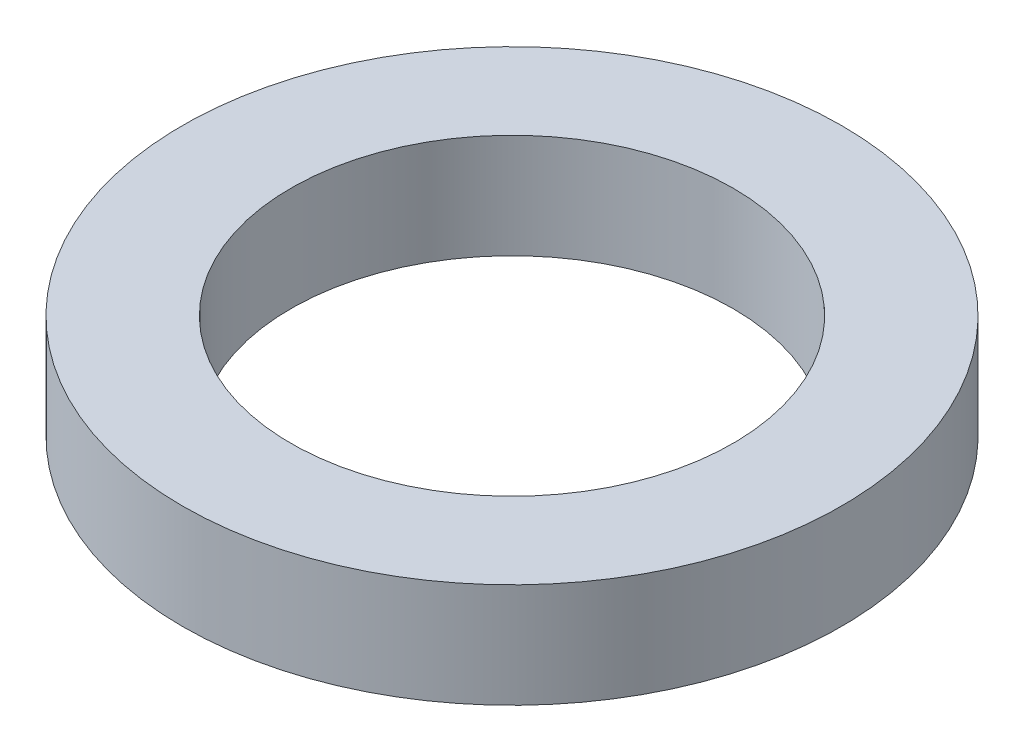
ISO-10303-21;
HEADER;
FILE_DESCRIPTION(('STEP AP214'),'2;1');
FILE_NAME('part.step','',(''),(''),'','','');
FILE_SCHEMA(('AUTOMOTIVE_DESIGN { 1 0 10303 214 1 1 1 1 }'));
ENDSEC;
DATA;
#1=APPLICATION_CONTEXT('core data for automotive mechanical design processes');
#2=APPLICATION_PROTOCOL_DEFINITION('international standard','automotive_design',2000,#1);
#3=PRODUCT_CONTEXT('',#1,'mechanical');
#4=PRODUCT('Part','Part','',(#3));
#5=PRODUCT_RELATED_PRODUCT_CATEGORY('part','',(#4));
#6=PRODUCT_DEFINITION_FORMATION('','',#4);
#7=PRODUCT_DEFINITION_CONTEXT('part definition',#1,'design');
#8=PRODUCT_DEFINITION('design','',#6,#7);
#9=PRODUCT_DEFINITION_SHAPE('','',#8);
#10=(LENGTH_UNIT() NAMED_UNIT(*) SI_UNIT(.MILLI.,.METRE.));
#11=(NAMED_UNIT(*) PLANE_ANGLE_UNIT() SI_UNIT($,.RADIAN.));
#12=(NAMED_UNIT(*) SI_UNIT($,.STERADIAN.) SOLID_ANGLE_UNIT());
#13=UNCERTAINTY_MEASURE_WITH_UNIT(LENGTH_MEASURE(1.E-05),#10,'distance_accuracy_value','');
#14=(GEOMETRIC_REPRESENTATION_CONTEXT(3) GLOBAL_UNCERTAINTY_ASSIGNED_CONTEXT((#13)) GLOBAL_UNIT_ASSIGNED_CONTEXT((#10,
#11,#12)) REPRESENTATION_CONTEXT('',''));
#15=CARTESIAN_POINT('',(0.,0.,0.));
#16=DIRECTION('',(0.,0.,1.));
#17=DIRECTION('',(1.,0.,0.));
#18=AXIS2_PLACEMENT_3D('',#15,#16,#17);
#19=CARTESIAN_POINT('',(0.,0.95,0.));
#20=DIRECTION('',(0.,1.,0.));
#21=DIRECTION('',(0.,0.,1.));
#22=AXIS2_PLACEMENT_3D('',#19,#20,#21);
#23=PLANE('',#22);
#24=CARTESIAN_POINT('',(0.,0.95,0.));
#25=DIRECTION('',(0.,1.,0.));
#26=DIRECTION('',(0.,0.,1.));
#27=AXIS2_PLACEMENT_3D('',#24,#25,#26);
#28=CIRCLE('',#27,6.);
#29=CARTESIAN_POINT('',(0.,0.95,-6.));
#30=VERTEX_POINT('',#29);
#31=EDGE_CURVE('E10',#30,#30,#28,.T.);
#32=ORIENTED_EDGE('',*,*,#31,.T.);
#33=EDGE_LOOP('',(#32));
#34=FACE_BOUND('',#33,.T.);
#35=CARTESIAN_POINT('',(0.,0.95,0.));
#36=DIRECTION('',(0.,1.,0.));
#37=DIRECTION('',(0.,0.,1.));
#38=AXIS2_PLACEMENT_3D('',#35,#36,#37);
#39=CIRCLE('',#38,4.025);
#40=CARTESIAN_POINT('',(0.,0.95,-4.025));
#41=VERTEX_POINT('',#40);
#42=EDGE_CURVE('E41',#41,#41,#39,.T.);
#43=ORIENTED_EDGE('',*,*,#42,.F.);
#44=EDGE_LOOP('',(#43));
#45=FACE_BOUND('',#44,.T.);
#46=ADVANCED_FACE('F30',(#34,#45),#23,.T.);
#47=CARTESIAN_POINT('',(0.,-0.95,0.));
#48=DIRECTION('',(0.,1.,0.));
#49=DIRECTION('',(0.,0.,1.));
#50=AXIS2_PLACEMENT_3D('',#47,#48,#49);
#51=PLANE('',#50);
#52=CARTESIAN_POINT('',(0.,-0.95,0.));
#53=DIRECTION('',(0.,1.,0.));
#54=DIRECTION('',(0.,0.,1.));
#55=AXIS2_PLACEMENT_3D('',#52,#53,#54);
#56=CIRCLE('',#55,6.);
#57=CARTESIAN_POINT('',(0.,-0.95,-6.));
#58=VERTEX_POINT('',#57);
#59=EDGE_CURVE('E34',#58,#58,#56,.T.);
#60=ORIENTED_EDGE('',*,*,#59,.F.);
#61=EDGE_LOOP('',(#60));
#62=FACE_BOUND('',#61,.T.);
#63=CARTESIAN_POINT('',(0.,-0.95,0.));
#64=DIRECTION('',(0.,1.,0.));
#65=DIRECTION('',(0.,0.,1.));
#66=AXIS2_PLACEMENT_3D('',#63,#64,#65);
#67=CIRCLE('',#66,4.025);
#68=CARTESIAN_POINT('',(0.,-0.95,-4.025));
#69=VERTEX_POINT('',#68);
#70=EDGE_CURVE('E43',#69,#69,#67,.T.);
#71=ORIENTED_EDGE('',*,*,#70,.T.);
#72=EDGE_LOOP('',(#71));
#73=FACE_BOUND('',#72,.T.);
#74=ADVANCED_FACE('F53',(#62,#73),#51,.F.);
#75=CARTESIAN_POINT('',(0.,0.95,0.));
#76=DIRECTION('',(0.,-1.,0.));
#77=DIRECTION('',(0.,0.,-1.));
#78=AXIS2_PLACEMENT_3D('',#75,#76,#77);
#79=CYLINDRICAL_SURFACE('',#78,6.);
#80=CARTESIAN_POINT('',(0.,0.95,-6.));
#81=CARTESIAN_POINT('',(0.,0.930208333333333,-6.));
#82=CARTESIAN_POINT('',(0.,0.910416666666667,-6.));
#83=CARTESIAN_POINT('',(0.,0.870833333333333,-6.));
#84=CARTESIAN_POINT('',(0.,0.851041666666667,-6.));
#85=CARTESIAN_POINT('',(0.,0.811458333333333,-6.));
#86=CARTESIAN_POINT('',(0.,0.791666666666667,-6.));
#87=CARTESIAN_POINT('',(0.,0.752083333333333,-6.));
#88=CARTESIAN_POINT('',(0.,0.732291666666667,-6.));
#89=CARTESIAN_POINT('',(0.,0.692708333333333,-6.));
#90=CARTESIAN_POINT('',(0.,0.672916666666667,-6.));
#91=CARTESIAN_POINT('',(0.,0.633333333333333,-6.));
#92=CARTESIAN_POINT('',(0.,0.613541666666667,-6.));
#93=CARTESIAN_POINT('',(0.,0.573958333333333,-6.));
#94=CARTESIAN_POINT('',(0.,0.554166666666667,-6.));
#95=CARTESIAN_POINT('',(0.,0.514583333333333,-6.));
#96=CARTESIAN_POINT('',(0.,0.494791666666667,-6.));
#97=CARTESIAN_POINT('',(0.,0.455208333333333,-6.));
#98=CARTESIAN_POINT('',(0.,0.435416666666667,-6.));
#99=CARTESIAN_POINT('',(0.,0.395833333333333,-6.));
#100=CARTESIAN_POINT('',(0.,0.376041666666667,-6.));
#101=CARTESIAN_POINT('',(0.,0.336458333333333,-6.));
#102=CARTESIAN_POINT('',(0.,0.316666666666667,-6.));
#103=CARTESIAN_POINT('',(0.,0.277083333333333,-6.));
#104=CARTESIAN_POINT('',(0.,0.257291666666667,-6.));
#105=CARTESIAN_POINT('',(0.,0.217708333333333,-6.));
#106=CARTESIAN_POINT('',(0.,0.197916666666667,-6.));
#107=CARTESIAN_POINT('',(0.,0.158333333333333,-6.));
#108=CARTESIAN_POINT('',(0.,0.138541666666667,-6.));
#109=CARTESIAN_POINT('',(0.,0.0989583333333332,-6.));
#110=CARTESIAN_POINT('',(0.,0.0791666666666666,-6.));
#111=CARTESIAN_POINT('',(0.,0.0395833333333332,-6.));
#112=CARTESIAN_POINT('',(0.,0.0197916666666665,-6.));
#113=CARTESIAN_POINT('',(0.,-0.0197916666666667,-6.));
#114=CARTESIAN_POINT('',(0.,-0.0395833333333333,-6.));
#115=CARTESIAN_POINT('',(0.,-0.0791666666666665,-6.));
#116=CARTESIAN_POINT('',(0.,-0.0989583333333332,-6.));
#117=CARTESIAN_POINT('',(0.,-0.138541666666667,-6.));
#118=CARTESIAN_POINT('',(0.,-0.158333333333333,-6.));
#119=CARTESIAN_POINT('',(0.,-0.197916666666667,-6.));
#120=CARTESIAN_POINT('',(0.,-0.217708333333333,-6.));
#121=CARTESIAN_POINT('',(0.,-0.257291666666667,-6.));
#122=CARTESIAN_POINT('',(0.,-0.277083333333333,-6.));
#123=CARTESIAN_POINT('',(0.,-0.316666666666667,-6.));
#124=CARTESIAN_POINT('',(0.,-0.336458333333333,-6.));
#125=CARTESIAN_POINT('',(0.,-0.376041666666667,-6.));
#126=CARTESIAN_POINT('',(0.,-0.395833333333333,-6.));
#127=CARTESIAN_POINT('',(0.,-0.435416666666667,-6.));
#128=CARTESIAN_POINT('',(0.,-0.455208333333333,-6.));
#129=CARTESIAN_POINT('',(0.,-0.494791666666667,-6.));
#130=CARTESIAN_POINT('',(0.,-0.514583333333333,-6.));
#131=CARTESIAN_POINT('',(0.,-0.554166666666667,-6.));
#132=CARTESIAN_POINT('',(0.,-0.573958333333333,-6.));
#133=CARTESIAN_POINT('',(0.,-0.613541666666667,-6.));
#134=CARTESIAN_POINT('',(0.,-0.633333333333333,-6.));
#135=CARTESIAN_POINT('',(0.,-0.672916666666667,-6.));
#136=CARTESIAN_POINT('',(0.,-0.692708333333333,-6.));
#137=CARTESIAN_POINT('',(0.,-0.732291666666667,-6.));
#138=CARTESIAN_POINT('',(0.,-0.752083333333333,-6.));
#139=CARTESIAN_POINT('',(0.,-0.791666666666667,-6.));
#140=CARTESIAN_POINT('',(0.,-0.811458333333333,-6.));
#141=CARTESIAN_POINT('',(0.,-0.851041666666667,-6.));
#142=CARTESIAN_POINT('',(0.,-0.870833333333333,-6.));
#143=CARTESIAN_POINT('',(0.,-0.910416666666667,-6.));
#144=CARTESIAN_POINT('',(0.,-0.930208333333333,-6.));
#145=CARTESIAN_POINT('',(0.,-0.95,-6.));
#146=B_SPLINE_CURVE_WITH_KNOTS('',3,(#80,#81,#82,#83,#84,#85,#86,#87,#88,#89,#90,#91,#92,#93,
#94,#95,#96,#97,#98,#99,#100,#101,#102,#103,#104,#105,#106,#107,#108,#109,#110,#111,#112,#113,
#114,#115,#116,#117,#118,#119,#120,#121,#122,#123,#124,#125,#126,#127,#128,#129,#130,#131,#132,
#133,#134,#135,#136,#137,#138,#139,#140,#141,#142,#143,#144,#145),.UNSPECIFIED.,.F.,.F.,(4,2,2,
2,2,2,2,2,2,2,2,2,2,2,2,2,2,2,2,2,2,2,2,2,2,2,2,2,2,2,2,2,4),(0.,0.059375,0.11875,0.178125,
0.2375,0.296875,0.35625,0.415625,0.475,0.534375,0.59375,0.653125,0.7125,0.771875,0.83125,
0.890625,0.95,1.009375,1.06875,1.128125,1.1875,1.246875,1.30625,1.365625,1.425,1.484375,1.54375,
1.603125,1.6625,1.721875,1.78125,1.840625,1.9),.UNSPECIFIED.);
#147=EDGE_CURVE('BSEAM32',#30,#58,#146,.T.);
#148=ORIENTED_EDGE('',*,*,#31,.F.);
#149=ORIENTED_EDGE('',*,*,#59,.T.);
#150=ORIENTED_EDGE('',*,*,#147,.T.);
#151=ORIENTED_EDGE('',*,*,#147,.F.);
#152=EDGE_LOOP('',(#148,#150,#149,#151));
#153=FACE_BOUND('',#152,.T.);
#154=ADVANCED_FACE('F32',(#153),#79,.T.);
#155=CARTESIAN_POINT('',(0.,0.95,0.));
#156=DIRECTION('',(0.,-1.,0.));
#157=DIRECTION('',(0.,0.,-1.));
#158=AXIS2_PLACEMENT_3D('',#155,#156,#157);
#159=CYLINDRICAL_SURFACE('',#158,4.025);
#160=CARTESIAN_POINT('',(0.,0.95,-4.025));
#161=CARTESIAN_POINT('',(0.,0.930208333333333,-4.025));
#162=CARTESIAN_POINT('',(0.,0.910416666666667,-4.025));
#163=CARTESIAN_POINT('',(0.,0.870833333333333,-4.025));
#164=CARTESIAN_POINT('',(0.,0.851041666666667,-4.025));
#165=CARTESIAN_POINT('',(0.,0.811458333333333,-4.025));
#166=CARTESIAN_POINT('',(0.,0.791666666666667,-4.025));
#167=CARTESIAN_POINT('',(0.,0.752083333333333,-4.025));
#168=CARTESIAN_POINT('',(0.,0.732291666666667,-4.025));
#169=CARTESIAN_POINT('',(0.,0.692708333333333,-4.025));
#170=CARTESIAN_POINT('',(0.,0.672916666666667,-4.025));
#171=CARTESIAN_POINT('',(0.,0.633333333333333,-4.025));
#172=CARTESIAN_POINT('',(0.,0.613541666666667,-4.025));
#173=CARTESIAN_POINT('',(0.,0.573958333333333,-4.025));
#174=CARTESIAN_POINT('',(0.,0.554166666666667,-4.025));
#175=CARTESIAN_POINT('',(0.,0.514583333333333,-4.025));
#176=CARTESIAN_POINT('',(0.,0.494791666666667,-4.025));
#177=CARTESIAN_POINT('',(0.,0.455208333333333,-4.025));
#178=CARTESIAN_POINT('',(0.,0.435416666666667,-4.025));
#179=CARTESIAN_POINT('',(0.,0.395833333333333,-4.025));
#180=CARTESIAN_POINT('',(0.,0.376041666666667,-4.025));
#181=CARTESIAN_POINT('',(0.,0.336458333333333,-4.025));
#182=CARTESIAN_POINT('',(0.,0.316666666666667,-4.025));
#183=CARTESIAN_POINT('',(0.,0.277083333333333,-4.025));
#184=CARTESIAN_POINT('',(0.,0.257291666666667,-4.025));
#185=CARTESIAN_POINT('',(0.,0.217708333333333,-4.025));
#186=CARTESIAN_POINT('',(0.,0.197916666666667,-4.025));
#187=CARTESIAN_POINT('',(0.,0.158333333333333,-4.025));
#188=CARTESIAN_POINT('',(0.,0.138541666666667,-4.025));
#189=CARTESIAN_POINT('',(0.,0.0989583333333332,-4.025));
#190=CARTESIAN_POINT('',(0.,0.0791666666666666,-4.025));
#191=CARTESIAN_POINT('',(0.,0.0395833333333332,-4.025));
#192=CARTESIAN_POINT('',(0.,0.0197916666666665,-4.025));
#193=CARTESIAN_POINT('',(0.,-0.0197916666666667,-4.025));
#194=CARTESIAN_POINT('',(0.,-0.0395833333333333,-4.025));
#195=CARTESIAN_POINT('',(0.,-0.0791666666666665,-4.025));
#196=CARTESIAN_POINT('',(0.,-0.0989583333333332,-4.025));
#197=CARTESIAN_POINT('',(0.,-0.138541666666667,-4.025));
#198=CARTESIAN_POINT('',(0.,-0.158333333333333,-4.025));
#199=CARTESIAN_POINT('',(0.,-0.197916666666667,-4.025));
#200=CARTESIAN_POINT('',(0.,-0.217708333333333,-4.025));
#201=CARTESIAN_POINT('',(0.,-0.257291666666667,-4.025));
#202=CARTESIAN_POINT('',(0.,-0.277083333333333,-4.025));
#203=CARTESIAN_POINT('',(0.,-0.316666666666667,-4.025));
#204=CARTESIAN_POINT('',(0.,-0.336458333333333,-4.025));
#205=CARTESIAN_POINT('',(0.,-0.376041666666667,-4.025));
#206=CARTESIAN_POINT('',(0.,-0.395833333333333,-4.025));
#207=CARTESIAN_POINT('',(0.,-0.435416666666667,-4.025));
#208=CARTESIAN_POINT('',(0.,-0.455208333333333,-4.025));
#209=CARTESIAN_POINT('',(0.,-0.494791666666667,-4.025));
#210=CARTESIAN_POINT('',(0.,-0.514583333333333,-4.025));
#211=CARTESIAN_POINT('',(0.,-0.554166666666667,-4.025));
#212=CARTESIAN_POINT('',(0.,-0.573958333333333,-4.025));
#213=CARTESIAN_POINT('',(0.,-0.613541666666667,-4.025));
#214=CARTESIAN_POINT('',(0.,-0.633333333333333,-4.025));
#215=CARTESIAN_POINT('',(0.,-0.672916666666667,-4.025));
#216=CARTESIAN_POINT('',(0.,-0.692708333333333,-4.025));
#217=CARTESIAN_POINT('',(0.,-0.732291666666667,-4.025));
#218=CARTESIAN_POINT('',(0.,-0.752083333333333,-4.025));
#219=CARTESIAN_POINT('',(0.,-0.791666666666667,-4.025));
#220=CARTESIAN_POINT('',(0.,-0.811458333333333,-4.025));
#221=CARTESIAN_POINT('',(0.,-0.851041666666667,-4.025));
#222=CARTESIAN_POINT('',(0.,-0.870833333333333,-4.025));
#223=CARTESIAN_POINT('',(0.,-0.910416666666667,-4.025));
#224=CARTESIAN_POINT('',(0.,-0.930208333333333,-4.025));
#225=CARTESIAN_POINT('',(0.,-0.95,-4.025));
#226=B_SPLINE_CURVE_WITH_KNOTS('',3,(#160,#161,#162,#163,#164,#165,#166,#167,#168,#169,#170,
#171,#172,#173,#174,#175,#176,#177,#178,#179,#180,#181,#182,#183,#184,#185,#186,#187,#188,#189,
#190,#191,#192,#193,#194,#195,#196,#197,#198,#199,#200,#201,#202,#203,#204,#205,#206,#207,#208,
#209,#210,#211,#212,#213,#214,#215,#216,#217,#218,#219,#220,#221,#222,#223,#224,#225),
.UNSPECIFIED.,.F.,.F.,(4,2,2,2,2,2,2,2,2,2,2,2,2,2,2,2,2,2,2,2,2,2,2,2,2,2,2,2,2,2,2,2,4),(0.,
0.059375,0.11875,0.178125,0.2375,0.296875,0.35625,0.415625,0.475,0.534375,0.59375,0.653125,
0.7125,0.771875,0.83125,0.890625,0.95,1.009375,1.06875,1.128125,1.1875,1.246875,1.30625,
1.365625,1.425,1.484375,1.54375,1.603125,1.6625,1.721875,1.78125,1.840625,1.9),.UNSPECIFIED.);
#227=EDGE_CURVE('BSEAM49',#41,#69,#226,.T.);
#228=ORIENTED_EDGE('',*,*,#42,.T.);
#229=ORIENTED_EDGE('',*,*,#70,.F.);
#230=ORIENTED_EDGE('',*,*,#227,.T.);
#231=ORIENTED_EDGE('',*,*,#227,.F.);
#232=EDGE_LOOP('',(#228,#230,#229,#231));
#233=FACE_BOUND('',#232,.T.);
#234=ADVANCED_FACE('F49',(#233),#159,.F.);
#235=CLOSED_SHELL('',(#46,#74,#154,#234));
#236=MANIFOLD_SOLID_BREP('B2',#235);
#237=ADVANCED_BREP_SHAPE_REPRESENTATION('',(#18,#236),#14);
#238=SHAPE_DEFINITION_REPRESENTATION(#9,#237);
ENDSEC;
END-ISO-10303-21;
